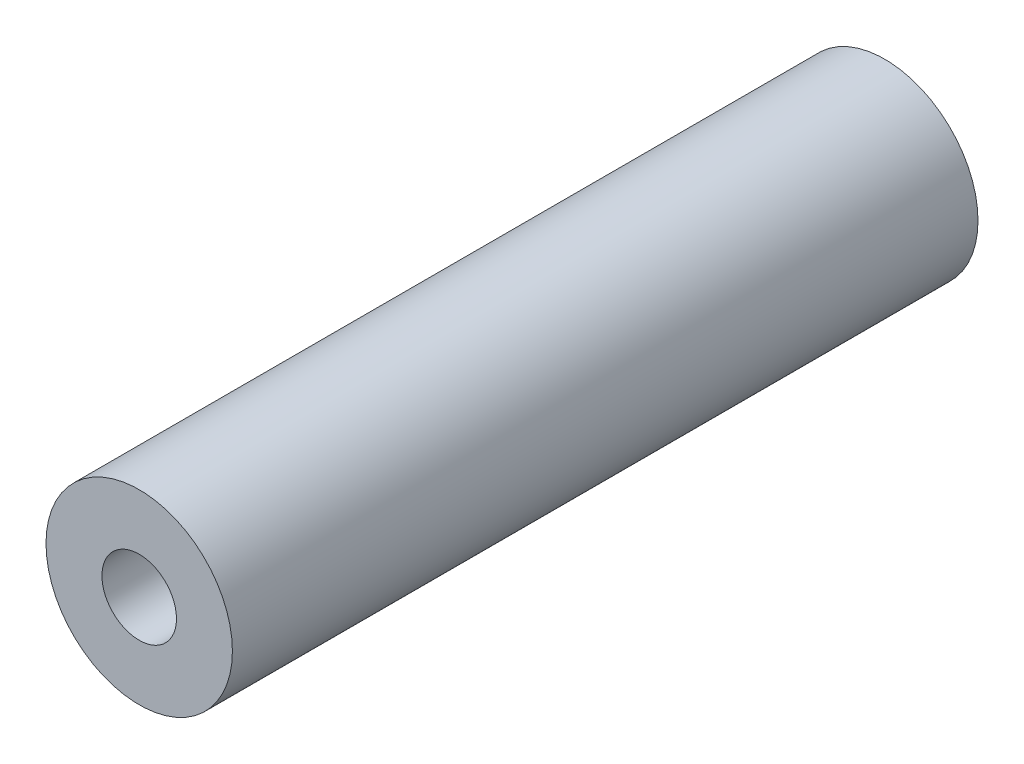
ISO-10303-21;
HEADER;
FILE_DESCRIPTION(('STEP AP214'),'2;1');
FILE_NAME('part.step','',(''),(''),'','','');
FILE_SCHEMA(('AUTOMOTIVE_DESIGN { 1 0 10303 214 1 1 1 1 }'));
ENDSEC;
DATA;
#1=APPLICATION_CONTEXT('core data for automotive mechanical design processes');
#2=APPLICATION_PROTOCOL_DEFINITION('international standard','automotive_design',2000,#1);
#3=PRODUCT_CONTEXT('',#1,'mechanical');
#4=PRODUCT('Part','Part','',(#3));
#5=PRODUCT_RELATED_PRODUCT_CATEGORY('part','',(#4));
#6=PRODUCT_DEFINITION_FORMATION('','',#4);
#7=PRODUCT_DEFINITION_CONTEXT('part definition',#1,'design');
#8=PRODUCT_DEFINITION('design','',#6,#7);
#9=PRODUCT_DEFINITION_SHAPE('','',#8);
#10=(LENGTH_UNIT() NAMED_UNIT(*) SI_UNIT(.MILLI.,.METRE.));
#11=(NAMED_UNIT(*) PLANE_ANGLE_UNIT() SI_UNIT($,.RADIAN.));
#12=(NAMED_UNIT(*) SI_UNIT($,.STERADIAN.) SOLID_ANGLE_UNIT());
#13=UNCERTAINTY_MEASURE_WITH_UNIT(LENGTH_MEASURE(1.E-05),#10,'distance_accuracy_value','');
#14=(GEOMETRIC_REPRESENTATION_CONTEXT(3) GLOBAL_UNCERTAINTY_ASSIGNED_CONTEXT((#13)) GLOBAL_UNIT_ASSIGNED_CONTEXT((#10,
#11,#12)) REPRESENTATION_CONTEXT('',''));
#15=CARTESIAN_POINT('',(0.,0.,0.));
#16=DIRECTION('',(0.,0.,1.));
#17=DIRECTION('',(1.,0.,0.));
#18=AXIS2_PLACEMENT_3D('',#15,#16,#17);
#19=CARTESIAN_POINT('',(0.,0.,20.));
#20=DIRECTION('',(0.,0.,1.));
#21=DIRECTION('',(1.,0.,0.));
#22=AXIS2_PLACEMENT_3D('',#19,#20,#21);
#23=PLANE('',#22);
#24=CARTESIAN_POINT('',(0.,0.,20.));
#25=DIRECTION('',(0.,0.,1.));
#26=DIRECTION('',(1.,0.,0.));
#27=AXIS2_PLACEMENT_3D('',#24,#25,#26);
#28=CIRCLE('',#27,2.5);
#29=CARTESIAN_POINT('',(2.5,0.,20.));
#30=VERTEX_POINT('',#29);
#31=EDGE_CURVE('E10',#30,#30,#28,.T.);
#32=ORIENTED_EDGE('',*,*,#31,.T.);
#33=EDGE_LOOP('',(#32));
#34=FACE_BOUND('',#33,.T.);
#35=CARTESIAN_POINT('',(0.,0.,20.));
#36=DIRECTION('',(0.,0.,1.));
#37=DIRECTION('',(1.,0.,0.));
#38=AXIS2_PLACEMENT_3D('',#35,#36,#37);
#39=CIRCLE('',#38,1.);
#40=CARTESIAN_POINT('',(1.,0.,20.));
#41=VERTEX_POINT('',#40);
#42=EDGE_CURVE('E42',#41,#41,#39,.T.);
#43=ORIENTED_EDGE('',*,*,#42,.F.);
#44=EDGE_LOOP('',(#43));
#45=FACE_BOUND('',#44,.T.);
#46=ADVANCED_FACE('F31',(#34,#45),#23,.T.);
#47=CARTESIAN_POINT('',(0.,0.,0.));
#48=DIRECTION('',(0.,0.,1.));
#49=DIRECTION('',(1.,0.,0.));
#50=AXIS2_PLACEMENT_3D('',#47,#48,#49);
#51=PLANE('',#50);
#52=CARTESIAN_POINT('',(0.,0.,0.));
#53=DIRECTION('',(0.,0.,1.));
#54=DIRECTION('',(1.,0.,0.));
#55=AXIS2_PLACEMENT_3D('',#52,#53,#54);
#56=CIRCLE('',#55,2.5);
#57=CARTESIAN_POINT('',(2.5,0.,0.));
#58=VERTEX_POINT('',#57);
#59=EDGE_CURVE('E35',#58,#58,#56,.T.);
#60=ORIENTED_EDGE('',*,*,#59,.F.);
#61=EDGE_LOOP('',(#60));
#62=FACE_BOUND('',#61,.T.);
#63=CARTESIAN_POINT('',(0.,0.,0.));
#64=DIRECTION('',(0.,0.,1.));
#65=DIRECTION('',(1.,0.,0.));
#66=AXIS2_PLACEMENT_3D('',#63,#64,#65);
#67=CIRCLE('',#66,1.);
#68=CARTESIAN_POINT('',(1.,0.,0.));
#69=VERTEX_POINT('',#68);
#70=EDGE_CURVE('E44',#69,#69,#67,.T.);
#71=ORIENTED_EDGE('',*,*,#70,.T.);
#72=EDGE_LOOP('',(#71));
#73=FACE_BOUND('',#72,.T.);
#74=ADVANCED_FACE('F54',(#62,#73),#51,.F.);
#75=CARTESIAN_POINT('',(0.,0.,20.));
#76=DIRECTION('',(0.,0.,-1.));
#77=DIRECTION('',(-1.,0.,0.));
#78=AXIS2_PLACEMENT_3D('',#75,#76,#77);
#79=CYLINDRICAL_SURFACE('',#78,2.5);
#80=ORIENTED_EDGE('',*,*,#31,.F.);
#81=EDGE_LOOP('',(#80));
#82=FACE_BOUND('',#81,.T.);
#83=ORIENTED_EDGE('',*,*,#59,.T.);
#84=EDGE_LOOP('',(#83));
#85=FACE_BOUND('',#84,.T.);
#86=ADVANCED_FACE('F33',(#82,#85),#79,.T.);
#87=CARTESIAN_POINT('',(0.,0.,20.));
#88=DIRECTION('',(0.,0.,-1.));
#89=DIRECTION('',(-1.,0.,0.));
#90=AXIS2_PLACEMENT_3D('',#87,#88,#89);
#91=CYLINDRICAL_SURFACE('',#90,1.);
#92=ORIENTED_EDGE('',*,*,#42,.T.);
#93=EDGE_LOOP('',(#92));
#94=FACE_BOUND('',#93,.T.);
#95=ORIENTED_EDGE('',*,*,#70,.F.);
#96=EDGE_LOOP('',(#95));
#97=FACE_BOUND('',#96,.T.);
#98=ADVANCED_FACE('F50',(#94,#97),#91,.F.);
#99=CLOSED_SHELL('',(#46,#74,#86,#98));
#100=MANIFOLD_SOLID_BREP('B2',#99);
#101=ADVANCED_BREP_SHAPE_REPRESENTATION('',(#18,#100),#14);
#102=SHAPE_DEFINITION_REPRESENTATION(#9,#101);
ENDSEC;
END-ISO-10303-21;
